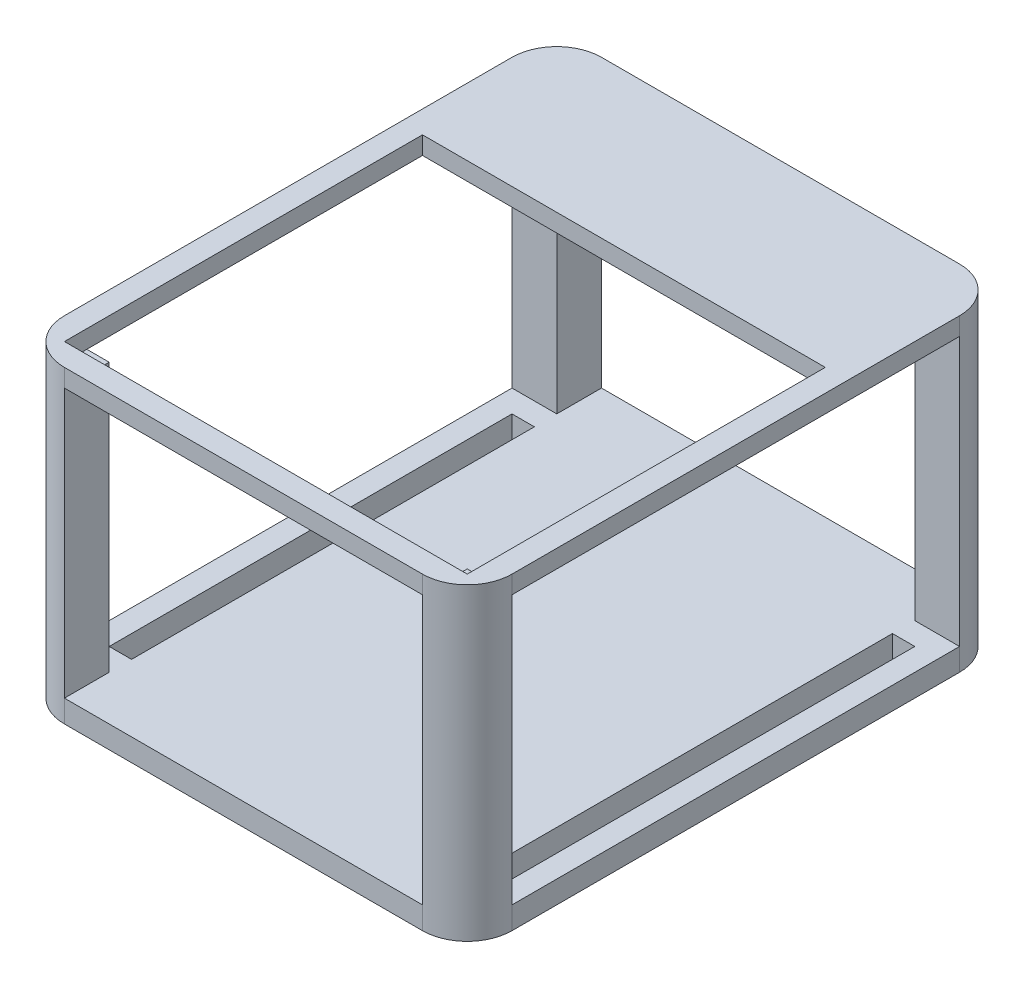
ISO-10303-21;
HEADER;
FILE_DESCRIPTION(('STEP AP214'),'2;1');
FILE_NAME('part.step','',(''),(''),'','','');
FILE_SCHEMA(('AUTOMOTIVE_DESIGN { 1 0 10303 214 1 1 1 1 }'));
ENDSEC;
DATA;
#1=APPLICATION_CONTEXT('core data for automotive mechanical design processes');
#2=APPLICATION_PROTOCOL_DEFINITION('international standard','automotive_design',2000,#1);
#3=PRODUCT_CONTEXT('',#1,'mechanical');
#4=PRODUCT('Part','Part','',(#3));
#5=PRODUCT_RELATED_PRODUCT_CATEGORY('part','',(#4));
#6=PRODUCT_DEFINITION_FORMATION('','',#4);
#7=PRODUCT_DEFINITION_CONTEXT('part definition',#1,'design');
#8=PRODUCT_DEFINITION('design','',#6,#7);
#9=PRODUCT_DEFINITION_SHAPE('','',#8);
#10=(LENGTH_UNIT() NAMED_UNIT(*) SI_UNIT(.MILLI.,.METRE.));
#11=(NAMED_UNIT(*) PLANE_ANGLE_UNIT() SI_UNIT($,.RADIAN.));
#12=(NAMED_UNIT(*) SI_UNIT($,.STERADIAN.) SOLID_ANGLE_UNIT());
#13=UNCERTAINTY_MEASURE_WITH_UNIT(LENGTH_MEASURE(1.E-05),#10,'distance_accuracy_value','');
#14=(GEOMETRIC_REPRESENTATION_CONTEXT(3) GLOBAL_UNCERTAINTY_ASSIGNED_CONTEXT((#13)) GLOBAL_UNIT_ASSIGNED_CONTEXT((#10,
#11,#12)) REPRESENTATION_CONTEXT('',''));
#15=CARTESIAN_POINT('',(0.,0.,0.));
#16=DIRECTION('',(0.,0.,1.));
#17=DIRECTION('',(1.,0.,0.));
#18=AXIS2_PLACEMENT_3D('',#15,#16,#17);
#19=CARTESIAN_POINT('',(40.,65.,-50.));
#20=DIRECTION('',(0.,1.,0.));
#21=DIRECTION('',(0.,0.,1.));
#22=AXIS2_PLACEMENT_3D('',#19,#20,#21);
#23=PLANE('',#22);
#24=DIRECTION('',(-1.,0.,0.));
#25=VECTOR('',#24,1.);
#26=CARTESIAN_POINT('',(-45.,65.,-25.));
#27=LINE('',#26,#25);
#28=CARTESIAN_POINT('',(45.,65.,-25.));
#29=VERTEX_POINT('',#28);
#30=CARTESIAN_POINT('',(-45.,65.,-25.));
#31=VERTEX_POINT('',#30);
#32=EDGE_CURVE('E281',#29,#31,#27,.T.);
#33=ORIENTED_EDGE('',*,*,#32,.T.);
#34=DIRECTION('',(0.,0.,1.));
#35=VECTOR('',#34,1.);
#36=CARTESIAN_POINT('',(-45.,65.,-25.));
#37=LINE('',#36,#35);
#38=CARTESIAN_POINT('',(-45.,65.,50.));
#39=VERTEX_POINT('',#38);
#40=EDGE_CURVE('E273',#31,#39,#37,.T.);
#41=ORIENTED_EDGE('',*,*,#40,.T.);
#42=DIRECTION('',(-1.,0.,0.));
#43=VECTOR('',#42,1.);
#44=CARTESIAN_POINT('',(-50.,65.,50.));
#45=LINE('',#44,#43);
#46=CARTESIAN_POINT('',(-50.,65.,50.));
#47=VERTEX_POINT('',#46);
#48=EDGE_CURVE('E297',#39,#47,#45,.T.);
#49=ORIENTED_EDGE('',*,*,#48,.T.);
#50=DIRECTION('',(0.,0.,1.));
#51=VECTOR('',#50,1.);
#52=CARTESIAN_POINT('',(-50.,65.,-50.));
#53=LINE('',#52,#51);
#54=CARTESIAN_POINT('',(-50.,65.,-50.));
#55=VERTEX_POINT('',#54);
#56=EDGE_CURVE('E580',#55,#47,#53,.T.);
#57=ORIENTED_EDGE('',*,*,#56,.F.);
#58=DIRECTION('',(1.,0.,0.));
#59=VECTOR('',#58,1.);
#60=CARTESIAN_POINT('',(-50.,65.,-50.));
#61=LINE('',#60,#59);
#62=CARTESIAN_POINT('',(-40.,65.,-50.));
#63=VERTEX_POINT('',#62);
#64=EDGE_CURVE('E319',#55,#63,#61,.T.);
#65=ORIENTED_EDGE('',*,*,#64,.T.);
#66=DIRECTION('',(0.,0.,-1.));
#67=VECTOR('',#66,1.);
#68=CARTESIAN_POINT('',(-40.,65.,-50.));
#69=LINE('',#68,#67);
#70=CARTESIAN_POINT('',(-40.,65.,-60.));
#71=VERTEX_POINT('',#70);
#72=EDGE_CURVE('E322',#63,#71,#69,.T.);
#73=ORIENTED_EDGE('',*,*,#72,.T.);
#74=DIRECTION('',(-1.,0.,0.));
#75=VECTOR('',#74,1.);
#76=CARTESIAN_POINT('',(40.,65.,-60.));
#77=LINE('',#76,#75);
#78=CARTESIAN_POINT('',(40.,65.,-60.));
#79=VERTEX_POINT('',#78);
#80=EDGE_CURVE('E582',#79,#71,#77,.T.);
#81=ORIENTED_EDGE('',*,*,#80,.F.);
#82=DIRECTION('',(0.,0.,1.));
#83=VECTOR('',#82,1.);
#84=CARTESIAN_POINT('',(40.,65.,-60.));
#85=LINE('',#84,#83);
#86=CARTESIAN_POINT('',(40.,65.,-50.));
#87=VERTEX_POINT('',#86);
#88=EDGE_CURVE('E528',#79,#87,#85,.T.);
#89=ORIENTED_EDGE('',*,*,#88,.T.);
#90=DIRECTION('',(1.,0.,0.));
#91=VECTOR('',#90,1.);
#92=CARTESIAN_POINT('',(40.,65.,-50.));
#93=LINE('',#92,#91);
#94=CARTESIAN_POINT('',(50.,65.,-50.));
#95=VERTEX_POINT('',#94);
#96=EDGE_CURVE('E524',#87,#95,#93,.T.);
#97=ORIENTED_EDGE('',*,*,#96,.T.);
#98=DIRECTION('',(0.,0.,-1.));
#99=VECTOR('',#98,1.);
#100=CARTESIAN_POINT('',(50.,65.,50.));
#101=LINE('',#100,#99);
#102=CARTESIAN_POINT('',(50.,65.,50.));
#103=VERTEX_POINT('',#102);
#104=EDGE_CURVE('E574',#103,#95,#101,.T.);
#105=ORIENTED_EDGE('',*,*,#104,.F.);
#106=DIRECTION('',(-1.,0.,0.));
#107=VECTOR('',#106,1.);
#108=CARTESIAN_POINT('',(50.,65.,50.));
#109=LINE('',#108,#107);
#110=CARTESIAN_POINT('',(45.,65.,50.));
#111=VERTEX_POINT('',#110);
#112=EDGE_CURVE('E506',#103,#111,#109,.T.);
#113=ORIENTED_EDGE('',*,*,#112,.T.);
#114=DIRECTION('',(0.,0.,-1.));
#115=VECTOR('',#114,1.);
#116=CARTESIAN_POINT('',(45.,65.,-25.));
#117=LINE('',#116,#115);
#118=EDGE_CURVE('E286',#111,#29,#117,.T.);
#119=ORIENTED_EDGE('',*,*,#118,.T.);
#120=EDGE_LOOP('',(#33,#41,#49,#57,#65,#73,#81,#89,#97,#105,#113,#119));
#121=FACE_BOUND('',#120,.T.);
#122=ADVANCED_FACE('F42',(#121),#23,.F.);
#123=CARTESIAN_POINT('',(40.,5.,-50.));
#124=DIRECTION('',(0.,-1.,0.));
#125=DIRECTION('',(0.,0.,-1.));
#126=AXIS2_PLACEMENT_3D('',#123,#124,#125);
#127=CYLINDRICAL_SURFACE('',#126,10.);
#128=CARTESIAN_POINT('',(40.,0.,-50.));
#129=DIRECTION('',(0.,1.,0.));
#130=DIRECTION('',(0.,0.,1.));
#131=AXIS2_PLACEMENT_3D('',#128,#129,#130);
#132=CIRCLE('',#131,10.);
#133=CARTESIAN_POINT('',(50.,0.,-50.));
#134=VERTEX_POINT('',#133);
#135=CARTESIAN_POINT('',(40.,0.,-60.));
#136=VERTEX_POINT('',#135);
#137=EDGE_CURVE('E369',#134,#136,#132,.T.);
#138=ORIENTED_EDGE('',*,*,#137,.T.);
#139=DIRECTION('',(0.,-1.,0.));
#140=VECTOR('',#139,1.);
#141=CARTESIAN_POINT('',(40.,5.,-60.));
#142=LINE('',#141,#140);
#143=CARTESIAN_POINT('',(40.,5.,-60.));
#144=VERTEX_POINT('',#143);
#145=EDGE_CURVE('E11',#144,#136,#142,.T.);
#146=ORIENTED_EDGE('',*,*,#145,.F.);
#147=DIRECTION('',(0.,-1.,0.));
#148=VECTOR('',#147,1.);
#149=CARTESIAN_POINT('',(40.,65.,-60.));
#150=LINE('',#149,#148);
#151=EDGE_CURVE('E515',#79,#144,#150,.T.);
#152=ORIENTED_EDGE('',*,*,#151,.F.);
#153=DIRECTION('',(0.,-1.,0.));
#154=VECTOR('',#153,1.);
#155=CARTESIAN_POINT('',(40.,69.,-60.));
#156=LINE('',#155,#154);
#157=CARTESIAN_POINT('',(40.,69.,-60.));
#158=VERTEX_POINT('',#157);
#159=EDGE_CURVE('E489',#158,#79,#156,.T.);
#160=ORIENTED_EDGE('',*,*,#159,.F.);
#161=CARTESIAN_POINT('',(40.,69.,-50.));
#162=DIRECTION('',(0.,1.,0.));
#163=DIRECTION('',(0.,0.,1.));
#164=AXIS2_PLACEMENT_3D('',#161,#162,#163);
#165=CIRCLE('',#164,10.);
#166=CARTESIAN_POINT('',(50.,69.,-50.));
#167=VERTEX_POINT('',#166);
#168=EDGE_CURVE('E577',#167,#158,#165,.T.);
#169=ORIENTED_EDGE('',*,*,#168,.F.);
#170=DIRECTION('',(0.,-1.,0.));
#171=VECTOR('',#170,1.);
#172=CARTESIAN_POINT('',(50.,69.,-50.));
#173=LINE('',#172,#171);
#174=EDGE_CURVE('E568',#167,#95,#173,.T.);
#175=ORIENTED_EDGE('',*,*,#174,.T.);
#176=DIRECTION('',(0.,-1.,0.));
#177=VECTOR('',#176,1.);
#178=CARTESIAN_POINT('',(50.,65.,-50.));
#179=LINE('',#178,#177);
#180=CARTESIAN_POINT('',(50.,5.,-50.));
#181=VERTEX_POINT('',#180);
#182=EDGE_CURVE('E521',#95,#181,#179,.T.);
#183=ORIENTED_EDGE('',*,*,#182,.T.);
#184=DIRECTION('',(0.,-1.,0.));
#185=VECTOR('',#184,1.);
#186=CARTESIAN_POINT('',(50.,5.,-50.));
#187=LINE('',#186,#185);
#188=EDGE_CURVE('E415',#181,#134,#187,.T.);
#189=ORIENTED_EDGE('',*,*,#188,.T.);
#190=EDGE_LOOP('',(#138,#146,#152,#160,#169,#175,#183,#189));
#191=FACE_BOUND('',#190,.T.);
#192=ADVANCED_FACE('F44',(#191),#127,.T.);
#193=CARTESIAN_POINT('',(-40.,5.,-60.));
#194=DIRECTION('',(0.,0.,1.));
#195=DIRECTION('',(1.,0.,0.));
#196=AXIS2_PLACEMENT_3D('',#193,#194,#195);
#197=PLANE('',#196);
#198=DIRECTION('',(-1.,0.,0.));
#199=VECTOR('',#198,1.);
#200=CARTESIAN_POINT('',(-40.,0.,-60.));
#201=LINE('',#200,#199);
#202=CARTESIAN_POINT('',(-40.,0.,-60.));
#203=VERTEX_POINT('',#202);
#204=EDGE_CURVE('E418',#136,#203,#201,.T.);
#205=ORIENTED_EDGE('',*,*,#204,.T.);
#206=DIRECTION('',(0.,-1.,0.));
#207=VECTOR('',#206,1.);
#208=CARTESIAN_POINT('',(-40.,5.,-60.));
#209=LINE('',#208,#207);
#210=CARTESIAN_POINT('',(-40.,5.,-60.));
#211=VERTEX_POINT('',#210);
#212=EDGE_CURVE('E50',#211,#203,#209,.T.);
#213=ORIENTED_EDGE('',*,*,#212,.F.);
#214=DIRECTION('',(-1.,0.,0.));
#215=VECTOR('',#214,1.);
#216=CARTESIAN_POINT('',(-40.,5.,-60.));
#217=LINE('',#216,#215);
#218=EDGE_CURVE('E406',#144,#211,#217,.T.);
#219=ORIENTED_EDGE('',*,*,#218,.F.);
#220=ORIENTED_EDGE('',*,*,#145,.T.);
#221=EDGE_LOOP('',(#205,#213,#219,#220));
#222=FACE_BOUND('',#221,.T.);
#223=ADVANCED_FACE('F642',(#222),#197,.F.);
#224=CARTESIAN_POINT('',(-40.,5.,-50.));
#225=DIRECTION('',(0.,-1.,0.));
#226=DIRECTION('',(0.,0.,-1.));
#227=AXIS2_PLACEMENT_3D('',#224,#225,#226);
#228=CYLINDRICAL_SURFACE('',#227,10.);
#229=CARTESIAN_POINT('',(-40.,0.,-50.));
#230=DIRECTION('',(0.,1.,0.));
#231=DIRECTION('',(0.,0.,-1.));
#232=AXIS2_PLACEMENT_3D('',#229,#230,#231);
#233=CIRCLE('',#232,10.);
#234=CARTESIAN_POINT('',(-50.,0.,-50.));
#235=VERTEX_POINT('',#234);
#236=EDGE_CURVE('E420',#203,#235,#233,.T.);
#237=ORIENTED_EDGE('',*,*,#236,.T.);
#238=DIRECTION('',(0.,-1.,0.));
#239=VECTOR('',#238,1.);
#240=CARTESIAN_POINT('',(-50.,5.,-50.));
#241=LINE('',#240,#239);
#242=CARTESIAN_POINT('',(-50.,5.,-50.));
#243=VERTEX_POINT('',#242);
#244=EDGE_CURVE('E445',#243,#235,#241,.T.);
#245=ORIENTED_EDGE('',*,*,#244,.F.);
#246=DIRECTION('',(0.,-1.,0.));
#247=VECTOR('',#246,1.);
#248=CARTESIAN_POINT('',(-50.,65.,-50.));
#249=LINE('',#248,#247);
#250=EDGE_CURVE('E338',#55,#243,#249,.T.);
#251=ORIENTED_EDGE('',*,*,#250,.F.);
#252=DIRECTION('',(0.,-1.,0.));
#253=VECTOR('',#252,1.);
#254=CARTESIAN_POINT('',(-50.,69.,-50.));
#255=LINE('',#254,#253);
#256=CARTESIAN_POINT('',(-50.,69.,-50.));
#257=VERTEX_POINT('',#256);
#258=EDGE_CURVE('E477',#257,#55,#255,.T.);
#259=ORIENTED_EDGE('',*,*,#258,.F.);
#260=CARTESIAN_POINT('',(-40.,69.,-50.));
#261=DIRECTION('',(0.,1.,0.));
#262=DIRECTION('',(0.,0.,1.));
#263=AXIS2_PLACEMENT_3D('',#260,#261,#262);
#264=CIRCLE('',#263,10.);
#265=CARTESIAN_POINT('',(-40.,69.,-60.));
#266=VERTEX_POINT('',#265);
#267=EDGE_CURVE('E593',#266,#257,#264,.T.);
#268=ORIENTED_EDGE('',*,*,#267,.F.);
#269=DIRECTION('',(0.,-1.,0.));
#270=VECTOR('',#269,1.);
#271=CARTESIAN_POINT('',(-40.,69.,-60.));
#272=LINE('',#271,#270);
#273=EDGE_CURVE('E481',#266,#71,#272,.T.);
#274=ORIENTED_EDGE('',*,*,#273,.T.);
#275=DIRECTION('',(0.,-1.,0.));
#276=VECTOR('',#275,1.);
#277=CARTESIAN_POINT('',(-40.,65.,-60.));
#278=LINE('',#277,#276);
#279=EDGE_CURVE('E326',#71,#211,#278,.T.);
#280=ORIENTED_EDGE('',*,*,#279,.T.);
#281=ORIENTED_EDGE('',*,*,#212,.T.);
#282=EDGE_LOOP('',(#237,#245,#251,#259,#268,#274,#280,#281));
#283=FACE_BOUND('',#282,.T.);
#284=ADVANCED_FACE('F451',(#283),#228,.T.);
#285=CARTESIAN_POINT('',(-50.,5.,-50.));
#286=DIRECTION('',(1.,0.,0.));
#287=DIRECTION('',(0.,0.,-1.));
#288=AXIS2_PLACEMENT_3D('',#285,#286,#287);
#289=PLANE('',#288);
#290=DIRECTION('',(0.,0.,1.));
#291=VECTOR('',#290,1.);
#292=CARTESIAN_POINT('',(-50.,0.,-50.));
#293=LINE('',#292,#291);
#294=CARTESIAN_POINT('',(-50.,0.,50.));
#295=VERTEX_POINT('',#294);
#296=EDGE_CURVE('E422',#235,#295,#293,.T.);
#297=ORIENTED_EDGE('',*,*,#296,.T.);
#298=DIRECTION('',(0.,-1.,0.));
#299=VECTOR('',#298,1.);
#300=CARTESIAN_POINT('',(-50.,5.,50.));
#301=LINE('',#300,#299);
#302=CARTESIAN_POINT('',(-50.,5.,50.));
#303=VERTEX_POINT('',#302);
#304=EDGE_CURVE('E442',#303,#295,#301,.T.);
#305=ORIENTED_EDGE('',*,*,#304,.F.);
#306=DIRECTION('',(0.,0.,1.));
#307=VECTOR('',#306,1.);
#308=CARTESIAN_POINT('',(-50.,5.,-50.));
#309=LINE('',#308,#307);
#310=EDGE_CURVE('E408',#243,#303,#309,.T.);
#311=ORIENTED_EDGE('',*,*,#310,.F.);
#312=ORIENTED_EDGE('',*,*,#244,.T.);
#313=EDGE_LOOP('',(#297,#305,#311,#312));
#314=FACE_BOUND('',#313,.T.);
#315=ADVANCED_FACE('F464',(#314),#289,.F.);
#316=CARTESIAN_POINT('',(-40.,5.,50.));
#317=DIRECTION('',(0.,-1.,0.));
#318=DIRECTION('',(0.,0.,-1.));
#319=AXIS2_PLACEMENT_3D('',#316,#317,#318);
#320=CYLINDRICAL_SURFACE('',#319,10.);
#321=CARTESIAN_POINT('',(-40.,0.,50.));
#322=DIRECTION('',(0.,1.,0.));
#323=DIRECTION('',(0.,0.,1.));
#324=AXIS2_PLACEMENT_3D('',#321,#322,#323);
#325=CIRCLE('',#324,10.);
#326=CARTESIAN_POINT('',(-40.,0.,60.));
#327=VERTEX_POINT('',#326);
#328=EDGE_CURVE('E424',#295,#327,#325,.T.);
#329=ORIENTED_EDGE('',*,*,#328,.T.);
#330=DIRECTION('',(0.,-1.,0.));
#331=VECTOR('',#330,1.);
#332=CARTESIAN_POINT('',(-40.,5.,60.));
#333=LINE('',#332,#331);
#334=CARTESIAN_POINT('',(-40.,5.,60.));
#335=VERTEX_POINT('',#334);
#336=EDGE_CURVE('E439',#335,#327,#333,.T.);
#337=ORIENTED_EDGE('',*,*,#336,.F.);
#338=DIRECTION('',(0.,-1.,0.));
#339=VECTOR('',#338,1.);
#340=CARTESIAN_POINT('',(-40.,65.,60.));
#341=LINE('',#340,#339);
#342=CARTESIAN_POINT('',(-40.,65.,60.));
#343=VERTEX_POINT('',#342);
#344=EDGE_CURVE('E509',#343,#335,#341,.T.);
#345=ORIENTED_EDGE('',*,*,#344,.F.);
#346=DIRECTION('',(0.,-1.,0.));
#347=VECTOR('',#346,1.);
#348=CARTESIAN_POINT('',(-40.,69.,60.));
#349=LINE('',#348,#347);
#350=CARTESIAN_POINT('',(-40.,69.,60.));
#351=VERTEX_POINT('',#350);
#352=EDGE_CURVE('E478',#351,#343,#349,.T.);
#353=ORIENTED_EDGE('',*,*,#352,.F.);
#354=CARTESIAN_POINT('',(-40.,69.,50.));
#355=DIRECTION('',(0.,1.,0.));
#356=DIRECTION('',(0.,0.,1.));
#357=AXIS2_PLACEMENT_3D('',#354,#355,#356);
#358=CIRCLE('',#357,10.);
#359=CARTESIAN_POINT('',(-50.,69.,50.));
#360=VERTEX_POINT('',#359);
#361=EDGE_CURVE('E474',#360,#351,#358,.T.);
#362=ORIENTED_EDGE('',*,*,#361,.F.);
#363=DIRECTION('',(0.,-1.,0.));
#364=VECTOR('',#363,1.);
#365=CARTESIAN_POINT('',(-50.,69.,50.));
#366=LINE('',#365,#364);
#367=EDGE_CURVE('E472',#360,#47,#366,.T.);
#368=ORIENTED_EDGE('',*,*,#367,.T.);
#369=DIRECTION('',(0.,-1.,0.));
#370=VECTOR('',#369,1.);
#371=CARTESIAN_POINT('',(-50.,65.,50.));
#372=LINE('',#371,#370);
#373=EDGE_CURVE('E305',#47,#303,#372,.T.);
#374=ORIENTED_EDGE('',*,*,#373,.T.);
#375=ORIENTED_EDGE('',*,*,#304,.T.);
#376=EDGE_LOOP('',(#329,#337,#345,#353,#362,#368,#374,#375));
#377=FACE_BOUND('',#376,.T.);
#378=ADVANCED_FACE('F467',(#377),#320,.T.);
#379=CARTESIAN_POINT('',(-40.,5.,60.));
#380=DIRECTION('',(0.,0.,-1.));
#381=DIRECTION('',(-1.,0.,0.));
#382=AXIS2_PLACEMENT_3D('',#379,#380,#381);
#383=PLANE('',#382);
#384=DIRECTION('',(1.,0.,0.));
#385=VECTOR('',#384,1.);
#386=CARTESIAN_POINT('',(-40.,0.,60.));
#387=LINE('',#386,#385);
#388=CARTESIAN_POINT('',(40.,0.,60.));
#389=VERTEX_POINT('',#388);
#390=EDGE_CURVE('E426',#327,#389,#387,.T.);
#391=ORIENTED_EDGE('',*,*,#390,.T.);
#392=DIRECTION('',(0.,-1.,0.));
#393=VECTOR('',#392,1.);
#394=CARTESIAN_POINT('',(40.,5.,60.));
#395=LINE('',#394,#393);
#396=CARTESIAN_POINT('',(40.,5.,60.));
#397=VERTEX_POINT('',#396);
#398=EDGE_CURVE('E436',#397,#389,#395,.T.);
#399=ORIENTED_EDGE('',*,*,#398,.F.);
#400=DIRECTION('',(1.,0.,0.));
#401=VECTOR('',#400,1.);
#402=CARTESIAN_POINT('',(-40.,5.,60.));
#403=LINE('',#402,#401);
#404=EDGE_CURVE('E411',#335,#397,#403,.T.);
#405=ORIENTED_EDGE('',*,*,#404,.F.);
#406=ORIENTED_EDGE('',*,*,#336,.T.);
#407=EDGE_LOOP('',(#391,#399,#405,#406));
#408=FACE_BOUND('',#407,.T.);
#409=ADVANCED_FACE('F548',(#408),#383,.F.);
#410=CARTESIAN_POINT('',(40.,5.,50.));
#411=DIRECTION('',(0.,-1.,0.));
#412=DIRECTION('',(0.,0.,-1.));
#413=AXIS2_PLACEMENT_3D('',#410,#411,#412);
#414=CYLINDRICAL_SURFACE('',#413,10.);
#415=CARTESIAN_POINT('',(40.,0.,50.));
#416=DIRECTION('',(0.,1.,0.));
#417=DIRECTION('',(0.,0.,1.));
#418=AXIS2_PLACEMENT_3D('',#415,#416,#417);
#419=CIRCLE('',#418,10.);
#420=CARTESIAN_POINT('',(50.,0.,50.));
#421=VERTEX_POINT('',#420);
#422=EDGE_CURVE('E428',#389,#421,#419,.T.);
#423=ORIENTED_EDGE('',*,*,#422,.T.);
#424=DIRECTION('',(0.,-1.,0.));
#425=VECTOR('',#424,1.);
#426=CARTESIAN_POINT('',(50.,5.,50.));
#427=LINE('',#426,#425);
#428=CARTESIAN_POINT('',(50.,5.,50.));
#429=VERTEX_POINT('',#428);
#430=EDGE_CURVE('E433',#429,#421,#427,.T.);
#431=ORIENTED_EDGE('',*,*,#430,.F.);
#432=DIRECTION('',(0.,-1.,0.));
#433=VECTOR('',#432,1.);
#434=CARTESIAN_POINT('',(50.,65.,50.));
#435=LINE('',#434,#433);
#436=EDGE_CURVE('E492',#103,#429,#435,.T.);
#437=ORIENTED_EDGE('',*,*,#436,.F.);
#438=DIRECTION('',(0.,-1.,0.));
#439=VECTOR('',#438,1.);
#440=CARTESIAN_POINT('',(50.,69.,50.));
#441=LINE('',#440,#439);
#442=CARTESIAN_POINT('',(50.,69.,50.));
#443=VERTEX_POINT('',#442);
#444=EDGE_CURVE('E566',#443,#103,#441,.T.);
#445=ORIENTED_EDGE('',*,*,#444,.F.);
#446=CARTESIAN_POINT('',(40.,69.,50.));
#447=DIRECTION('',(0.,1.,0.));
#448=DIRECTION('',(0.,0.,1.));
#449=AXIS2_PLACEMENT_3D('',#446,#447,#448);
#450=CIRCLE('',#449,10.);
#451=CARTESIAN_POINT('',(40.,69.,60.));
#452=VERTEX_POINT('',#451);
#453=EDGE_CURVE('E563',#452,#443,#450,.T.);
#454=ORIENTED_EDGE('',*,*,#453,.F.);
#455=DIRECTION('',(0.,-1.,0.));
#456=VECTOR('',#455,1.);
#457=CARTESIAN_POINT('',(40.,69.,60.));
#458=LINE('',#457,#456);
#459=CARTESIAN_POINT('',(40.,65.,60.));
#460=VERTEX_POINT('',#459);
#461=EDGE_CURVE('E484',#452,#460,#458,.T.);
#462=ORIENTED_EDGE('',*,*,#461,.T.);
#463=DIRECTION('',(0.,-1.,0.));
#464=VECTOR('',#463,1.);
#465=CARTESIAN_POINT('',(40.,65.,60.));
#466=LINE('',#465,#464);
#467=EDGE_CURVE('E498',#460,#397,#466,.T.);
#468=ORIENTED_EDGE('',*,*,#467,.T.);
#469=ORIENTED_EDGE('',*,*,#398,.T.);
#470=EDGE_LOOP('',(#423,#431,#437,#445,#454,#462,#468,#469));
#471=FACE_BOUND('',#470,.T.);
#472=ADVANCED_FACE('F559',(#471),#414,.T.);
#473=CARTESIAN_POINT('',(50.,5.,-50.));
#474=DIRECTION('',(-1.,0.,0.));
#475=DIRECTION('',(0.,0.,1.));
#476=AXIS2_PLACEMENT_3D('',#473,#474,#475);
#477=PLANE('',#476);
#478=DIRECTION('',(0.,0.,-1.));
#479=VECTOR('',#478,1.);
#480=CARTESIAN_POINT('',(50.,0.,-50.));
#481=LINE('',#480,#479);
#482=EDGE_CURVE('E409',#421,#134,#481,.T.);
#483=ORIENTED_EDGE('',*,*,#482,.T.);
#484=ORIENTED_EDGE('',*,*,#188,.F.);
#485=DIRECTION('',(0.,0.,-1.));
#486=VECTOR('',#485,1.);
#487=CARTESIAN_POINT('',(50.,5.,-50.));
#488=LINE('',#487,#486);
#489=EDGE_CURVE('E413',#429,#181,#488,.T.);
#490=ORIENTED_EDGE('',*,*,#489,.F.);
#491=ORIENTED_EDGE('',*,*,#430,.T.);
#492=EDGE_LOOP('',(#483,#484,#490,#491));
#493=FACE_BOUND('',#492,.T.);
#494=ADVANCED_FACE('F635',(#493),#477,.F.);
#495=CARTESIAN_POINT('',(40.,5.,-50.));
#496=DIRECTION('',(0.,1.,0.));
#497=DIRECTION('',(0.,0.,1.));
#498=AXIS2_PLACEMENT_3D('',#495,#496,#497);
#499=PLANE('',#498);
#500=DIRECTION('',(1.,0.,0.));
#501=VECTOR('',#500,1.);
#502=CARTESIAN_POINT('',(40.,5.,-50.));
#503=LINE('',#502,#501);
#504=CARTESIAN_POINT('',(40.,5.,-50.));
#505=VERTEX_POINT('',#504);
#506=EDGE_CURVE('E525',#505,#181,#503,.T.);
#507=ORIENTED_EDGE('',*,*,#506,.F.);
#508=DIRECTION('',(0.,0.,1.));
#509=VECTOR('',#508,1.);
#510=CARTESIAN_POINT('',(40.,5.,-60.));
#511=LINE('',#510,#509);
#512=EDGE_CURVE('E330',#144,#505,#511,.T.);
#513=ORIENTED_EDGE('',*,*,#512,.F.);
#514=ORIENTED_EDGE('',*,*,#218,.T.);
#515=DIRECTION('',(0.,0.,-1.));
#516=VECTOR('',#515,1.);
#517=CARTESIAN_POINT('',(-40.,5.,-50.));
#518=LINE('',#517,#516);
#519=CARTESIAN_POINT('',(-40.,5.,-50.));
#520=VERTEX_POINT('',#519);
#521=EDGE_CURVE('E323',#520,#211,#518,.T.);
#522=ORIENTED_EDGE('',*,*,#521,.F.);
#523=DIRECTION('',(1.,0.,0.));
#524=VECTOR('',#523,1.);
#525=CARTESIAN_POINT('',(-50.,5.,-50.));
#526=LINE('',#525,#524);
#527=EDGE_CURVE('E327',#243,#520,#526,.T.);
#528=ORIENTED_EDGE('',*,*,#527,.F.);
#529=ORIENTED_EDGE('',*,*,#310,.T.);
#530=DIRECTION('',(-1.,0.,0.));
#531=VECTOR('',#530,1.);
#532=CARTESIAN_POINT('',(-50.,5.,50.));
#533=LINE('',#532,#531);
#534=CARTESIAN_POINT('',(-40.,5.,50.));
#535=VERTEX_POINT('',#534);
#536=EDGE_CURVE('E318',#535,#303,#533,.T.);
#537=ORIENTED_EDGE('',*,*,#536,.F.);
#538=DIRECTION('',(0.,0.,-1.));
#539=VECTOR('',#538,1.);
#540=CARTESIAN_POINT('',(-40.,5.,50.));
#541=LINE('',#540,#539);
#542=EDGE_CURVE('E313',#335,#535,#541,.T.);
#543=ORIENTED_EDGE('',*,*,#542,.F.);
#544=ORIENTED_EDGE('',*,*,#404,.T.);
#545=DIRECTION('',(0.,0.,1.));
#546=VECTOR('',#545,1.);
#547=CARTESIAN_POINT('',(40.,5.,50.));
#548=LINE('',#547,#546);
#549=CARTESIAN_POINT('',(40.,5.,50.));
#550=VERTEX_POINT('',#549);
#551=EDGE_CURVE('E502',#550,#397,#548,.T.);
#552=ORIENTED_EDGE('',*,*,#551,.F.);
#553=DIRECTION('',(-1.,0.,0.));
#554=VECTOR('',#553,1.);
#555=CARTESIAN_POINT('',(50.,5.,50.));
#556=LINE('',#555,#554);
#557=EDGE_CURVE('E505',#429,#550,#556,.T.);
#558=ORIENTED_EDGE('',*,*,#557,.F.);
#559=ORIENTED_EDGE('',*,*,#489,.T.);
#560=EDGE_LOOP('',(#507,#513,#514,#522,#528,#529,#537,#543,#544,#552,#558,#559));
#561=FACE_BOUND('',#560,.T.);
#562=DIRECTION('',(0.,0.,1.));
#563=VECTOR('',#562,1.);
#564=CARTESIAN_POINT('',(-45.,5.,-45.));
#565=LINE('',#564,#563);
#566=CARTESIAN_POINT('',(-45.,5.,-45.));
#567=VERTEX_POINT('',#566);
#568=CARTESIAN_POINT('',(-45.,5.,45.));
#569=VERTEX_POINT('',#568);
#570=EDGE_CURVE('E356',#567,#569,#565,.T.);
#571=ORIENTED_EDGE('',*,*,#570,.F.);
#572=DIRECTION('',(-1.,0.,0.));
#573=VECTOR('',#572,1.);
#574=CARTESIAN_POINT('',(-45.,5.,-45.));
#575=LINE('',#574,#573);
#576=CARTESIAN_POINT('',(-40.,5.,-45.));
#577=VERTEX_POINT('',#576);
#578=EDGE_CURVE('E346',#577,#567,#575,.T.);
#579=ORIENTED_EDGE('',*,*,#578,.F.);
#580=DIRECTION('',(0.,0.,-1.));
#581=VECTOR('',#580,1.);
#582=CARTESIAN_POINT('',(-40.,5.,-45.));
#583=LINE('',#582,#581);
#584=CARTESIAN_POINT('',(-40.,5.,45.));
#585=VERTEX_POINT('',#584);
#586=EDGE_CURVE('E362',#585,#577,#583,.T.);
#587=ORIENTED_EDGE('',*,*,#586,.F.);
#588=DIRECTION('',(1.,0.,0.));
#589=VECTOR('',#588,1.);
#590=CARTESIAN_POINT('',(-45.,5.,45.));
#591=LINE('',#590,#589);
#592=EDGE_CURVE('E358',#569,#585,#591,.T.);
#593=ORIENTED_EDGE('',*,*,#592,.F.);
#594=EDGE_LOOP('',(#571,#579,#587,#593));
#595=FACE_BOUND('',#594,.T.);
#596=DIRECTION('',(0.,0.,1.));
#597=VECTOR('',#596,1.);
#598=CARTESIAN_POINT('',(40.,5.,-45.));
#599=LINE('',#598,#597);
#600=CARTESIAN_POINT('',(40.,5.,-45.));
#601=VERTEX_POINT('',#600);
#602=CARTESIAN_POINT('',(40.,5.,45.));
#603=VERTEX_POINT('',#602);
#604=EDGE_CURVE('E359',#601,#603,#599,.T.);
#605=ORIENTED_EDGE('',*,*,#604,.F.);
#606=DIRECTION('',(-1.,0.,0.));
#607=VECTOR('',#606,1.);
#608=CARTESIAN_POINT('',(40.,5.,-45.));
#609=LINE('',#608,#607);
#610=CARTESIAN_POINT('',(45.,5.,-45.));
#611=VERTEX_POINT('',#610);
#612=EDGE_CURVE('E385',#611,#601,#609,.T.);
#613=ORIENTED_EDGE('',*,*,#612,.F.);
#614=DIRECTION('',(0.,0.,-1.));
#615=VECTOR('',#614,1.);
#616=CARTESIAN_POINT('',(45.,5.,-45.));
#617=LINE('',#616,#615);
#618=CARTESIAN_POINT('',(45.,5.,45.));
#619=VERTEX_POINT('',#618);
#620=EDGE_CURVE('E388',#619,#611,#617,.T.);
#621=ORIENTED_EDGE('',*,*,#620,.F.);
#622=DIRECTION('',(1.,0.,0.));
#623=VECTOR('',#622,1.);
#624=CARTESIAN_POINT('',(40.,5.,45.));
#625=LINE('',#624,#623);
#626=EDGE_CURVE('E392',#603,#619,#625,.T.);
#627=ORIENTED_EDGE('',*,*,#626,.F.);
#628=EDGE_LOOP('',(#605,#613,#621,#627));
#629=FACE_BOUND('',#628,.T.);
#630=ADVANCED_FACE('F543',(#561,#595,#629),#499,.T.);
#631=CARTESIAN_POINT('',(40.,0.,-50.));
#632=DIRECTION('',(0.,1.,0.));
#633=DIRECTION('',(0.,0.,1.));
#634=AXIS2_PLACEMENT_3D('',#631,#632,#633);
#635=PLANE('',#634);
#636=DIRECTION('',(-1.,0.,0.));
#637=VECTOR('',#636,1.);
#638=CARTESIAN_POINT('',(-45.,0.,-45.));
#639=LINE('',#638,#637);
#640=CARTESIAN_POINT('',(-40.,0.,-45.));
#641=VERTEX_POINT('',#640);
#642=CARTESIAN_POINT('',(-45.,0.,-45.));
#643=VERTEX_POINT('',#642);
#644=EDGE_CURVE('E352',#641,#643,#639,.T.);
#645=ORIENTED_EDGE('',*,*,#644,.T.);
#646=DIRECTION('',(0.,0.,1.));
#647=VECTOR('',#646,1.);
#648=CARTESIAN_POINT('',(-45.,0.,-45.));
#649=LINE('',#648,#647);
#650=CARTESIAN_POINT('',(-45.,0.,45.));
#651=VERTEX_POINT('',#650);
#652=EDGE_CURVE('E342',#643,#651,#649,.T.);
#653=ORIENTED_EDGE('',*,*,#652,.T.);
#654=DIRECTION('',(1.,0.,0.));
#655=VECTOR('',#654,1.);
#656=CARTESIAN_POINT('',(-45.,0.,45.));
#657=LINE('',#656,#655);
#658=CARTESIAN_POINT('',(-40.,0.,45.));
#659=VERTEX_POINT('',#658);
#660=EDGE_CURVE('E345',#651,#659,#657,.T.);
#661=ORIENTED_EDGE('',*,*,#660,.T.);
#662=DIRECTION('',(0.,0.,-1.));
#663=VECTOR('',#662,1.);
#664=CARTESIAN_POINT('',(-40.,0.,-45.));
#665=LINE('',#664,#663);
#666=EDGE_CURVE('E349',#659,#641,#665,.T.);
#667=ORIENTED_EDGE('',*,*,#666,.T.);
#668=EDGE_LOOP('',(#645,#653,#661,#667));
#669=FACE_BOUND('',#668,.T.);
#670=DIRECTION('',(-1.,0.,0.));
#671=VECTOR('',#670,1.);
#672=CARTESIAN_POINT('',(40.,0.,-45.));
#673=LINE('',#672,#671);
#674=CARTESIAN_POINT('',(45.,0.,-45.));
#675=VERTEX_POINT('',#674);
#676=CARTESIAN_POINT('',(40.,0.,-45.));
#677=VERTEX_POINT('',#676);
#678=EDGE_CURVE('E379',#675,#677,#673,.T.);
#679=ORIENTED_EDGE('',*,*,#678,.T.);
#680=DIRECTION('',(0.,0.,1.));
#681=VECTOR('',#680,1.);
#682=CARTESIAN_POINT('',(40.,0.,-45.));
#683=LINE('',#682,#681);
#684=CARTESIAN_POINT('',(40.,0.,45.));
#685=VERTEX_POINT('',#684);
#686=EDGE_CURVE('E389',#677,#685,#683,.T.);
#687=ORIENTED_EDGE('',*,*,#686,.T.);
#688=DIRECTION('',(1.,0.,0.));
#689=VECTOR('',#688,1.);
#690=CARTESIAN_POINT('',(40.,0.,45.));
#691=LINE('',#690,#689);
#692=CARTESIAN_POINT('',(45.,0.,45.));
#693=VERTEX_POINT('',#692);
#694=EDGE_CURVE('E401',#685,#693,#691,.T.);
#695=ORIENTED_EDGE('',*,*,#694,.T.);
#696=DIRECTION('',(0.,0.,-1.));
#697=VECTOR('',#696,1.);
#698=CARTESIAN_POINT('',(45.,0.,-45.));
#699=LINE('',#698,#697);
#700=EDGE_CURVE('E398',#693,#675,#699,.T.);
#701=ORIENTED_EDGE('',*,*,#700,.T.);
#702=EDGE_LOOP('',(#679,#687,#695,#701));
#703=FACE_BOUND('',#702,.T.);
#704=ORIENTED_EDGE('',*,*,#137,.F.);
#705=ORIENTED_EDGE('',*,*,#482,.F.);
#706=ORIENTED_EDGE('',*,*,#422,.F.);
#707=ORIENTED_EDGE('',*,*,#390,.F.);
#708=ORIENTED_EDGE('',*,*,#328,.F.);
#709=ORIENTED_EDGE('',*,*,#296,.F.);
#710=ORIENTED_EDGE('',*,*,#236,.F.);
#711=ORIENTED_EDGE('',*,*,#204,.F.);
#712=EDGE_LOOP('',(#704,#705,#706,#707,#708,#709,#710,#711));
#713=FACE_BOUND('',#712,.T.);
#714=ADVANCED_FACE('F459',(#669,#703,#713),#635,.F.);
#715=CARTESIAN_POINT('',(40.,0.,-45.));
#716=DIRECTION('',(-1.,0.,0.));
#717=DIRECTION('',(0.,0.,1.));
#718=AXIS2_PLACEMENT_3D('',#715,#716,#717);
#719=PLANE('',#718);
#720=ORIENTED_EDGE('',*,*,#604,.T.);
#721=DIRECTION('',(0.,1.,0.));
#722=VECTOR('',#721,1.);
#723=CARTESIAN_POINT('',(40.,0.,45.));
#724=LINE('',#723,#722);
#725=EDGE_CURVE('E376',#685,#603,#724,.T.);
#726=ORIENTED_EDGE('',*,*,#725,.F.);
#727=ORIENTED_EDGE('',*,*,#686,.F.);
#728=DIRECTION('',(0.,1.,0.));
#729=VECTOR('',#728,1.);
#730=CARTESIAN_POINT('',(40.,0.,-45.));
#731=LINE('',#730,#729);
#732=EDGE_CURVE('E341',#677,#601,#731,.T.);
#733=ORIENTED_EDGE('',*,*,#732,.T.);
#734=EDGE_LOOP('',(#720,#726,#727,#733));
#735=FACE_BOUND('',#734,.T.);
#736=ADVANCED_FACE('F848',(#735),#719,.F.);
#737=CARTESIAN_POINT('',(40.,0.,-45.));
#738=DIRECTION('',(0.,0.,-1.));
#739=DIRECTION('',(-1.,0.,0.));
#740=AXIS2_PLACEMENT_3D('',#737,#738,#739);
#741=PLANE('',#740);
#742=ORIENTED_EDGE('',*,*,#612,.T.);
#743=ORIENTED_EDGE('',*,*,#732,.F.);
#744=ORIENTED_EDGE('',*,*,#678,.F.);
#745=DIRECTION('',(0.,1.,0.));
#746=VECTOR('',#745,1.);
#747=CARTESIAN_POINT('',(45.,0.,-45.));
#748=LINE('',#747,#746);
#749=EDGE_CURVE('E382',#675,#611,#748,.T.);
#750=ORIENTED_EDGE('',*,*,#749,.T.);
#751=EDGE_LOOP('',(#742,#743,#744,#750));
#752=FACE_BOUND('',#751,.T.);
#753=ADVANCED_FACE('F838',(#752),#741,.F.);
#754=CARTESIAN_POINT('',(45.,0.,-45.));
#755=DIRECTION('',(1.,0.,0.));
#756=DIRECTION('',(0.,0.,-1.));
#757=AXIS2_PLACEMENT_3D('',#754,#755,#756);
#758=PLANE('',#757);
#759=ORIENTED_EDGE('',*,*,#620,.T.);
#760=ORIENTED_EDGE('',*,*,#749,.F.);
#761=ORIENTED_EDGE('',*,*,#700,.F.);
#762=DIRECTION('',(0.,1.,0.));
#763=VECTOR('',#762,1.);
#764=CARTESIAN_POINT('',(45.,0.,45.));
#765=LINE('',#764,#763);
#766=EDGE_CURVE('E380',#693,#619,#765,.T.);
#767=ORIENTED_EDGE('',*,*,#766,.T.);
#768=EDGE_LOOP('',(#759,#760,#761,#767));
#769=FACE_BOUND('',#768,.T.);
#770=ADVANCED_FACE('F828',(#769),#758,.F.);
#771=CARTESIAN_POINT('',(40.,0.,45.));
#772=DIRECTION('',(0.,0.,1.));
#773=DIRECTION('',(1.,0.,0.));
#774=AXIS2_PLACEMENT_3D('',#771,#772,#773);
#775=PLANE('',#774);
#776=ORIENTED_EDGE('',*,*,#626,.T.);
#777=ORIENTED_EDGE('',*,*,#766,.F.);
#778=ORIENTED_EDGE('',*,*,#694,.F.);
#779=ORIENTED_EDGE('',*,*,#725,.T.);
#780=EDGE_LOOP('',(#776,#777,#778,#779));
#781=FACE_BOUND('',#780,.T.);
#782=ADVANCED_FACE('F818',(#781),#775,.F.);
#783=CARTESIAN_POINT('',(-45.,0.,-45.));
#784=DIRECTION('',(-1.,0.,0.));
#785=DIRECTION('',(0.,0.,1.));
#786=AXIS2_PLACEMENT_3D('',#783,#784,#785);
#787=PLANE('',#786);
#788=ORIENTED_EDGE('',*,*,#570,.T.);
#789=DIRECTION('',(0.,1.,0.));
#790=VECTOR('',#789,1.);
#791=CARTESIAN_POINT('',(-45.,0.,45.));
#792=LINE('',#791,#790);
#793=EDGE_CURVE('E355',#651,#569,#792,.T.);
#794=ORIENTED_EDGE('',*,*,#793,.F.);
#795=ORIENTED_EDGE('',*,*,#652,.F.);
#796=DIRECTION('',(0.,1.,0.));
#797=VECTOR('',#796,1.);
#798=CARTESIAN_POINT('',(-45.,0.,-45.));
#799=LINE('',#798,#797);
#800=EDGE_CURVE('E367',#643,#567,#799,.T.);
#801=ORIENTED_EDGE('',*,*,#800,.T.);
#802=EDGE_LOOP('',(#788,#794,#795,#801));
#803=FACE_BOUND('',#802,.T.);
#804=ADVANCED_FACE('F808',(#803),#787,.F.);
#805=CARTESIAN_POINT('',(-45.,0.,-45.));
#806=DIRECTION('',(0.,0.,-1.));
#807=DIRECTION('',(-1.,0.,0.));
#808=AXIS2_PLACEMENT_3D('',#805,#806,#807);
#809=PLANE('',#808);
#810=ORIENTED_EDGE('',*,*,#578,.T.);
#811=ORIENTED_EDGE('',*,*,#800,.F.);
#812=ORIENTED_EDGE('',*,*,#644,.F.);
#813=DIRECTION('',(0.,1.,0.));
#814=VECTOR('',#813,1.);
#815=CARTESIAN_POINT('',(-40.,0.,-45.));
#816=LINE('',#815,#814);
#817=EDGE_CURVE('E370',#641,#577,#816,.T.);
#818=ORIENTED_EDGE('',*,*,#817,.T.);
#819=EDGE_LOOP('',(#810,#811,#812,#818));
#820=FACE_BOUND('',#819,.T.);
#821=ADVANCED_FACE('F798',(#820),#809,.F.);
#822=CARTESIAN_POINT('',(-40.,0.,-45.));
#823=DIRECTION('',(1.,0.,0.));
#824=DIRECTION('',(0.,0.,-1.));
#825=AXIS2_PLACEMENT_3D('',#822,#823,#824);
#826=PLANE('',#825);
#827=ORIENTED_EDGE('',*,*,#586,.T.);
#828=ORIENTED_EDGE('',*,*,#817,.F.);
#829=ORIENTED_EDGE('',*,*,#666,.F.);
#830=DIRECTION('',(0.,1.,0.));
#831=VECTOR('',#830,1.);
#832=CARTESIAN_POINT('',(-40.,0.,45.));
#833=LINE('',#832,#831);
#834=EDGE_CURVE('E372',#659,#585,#833,.T.);
#835=ORIENTED_EDGE('',*,*,#834,.T.);
#836=EDGE_LOOP('',(#827,#828,#829,#835));
#837=FACE_BOUND('',#836,.T.);
#838=ADVANCED_FACE('F787',(#837),#826,.F.);
#839=CARTESIAN_POINT('',(-45.,0.,45.));
#840=DIRECTION('',(0.,0.,1.));
#841=DIRECTION('',(1.,0.,0.));
#842=AXIS2_PLACEMENT_3D('',#839,#840,#841);
#843=PLANE('',#842);
#844=ORIENTED_EDGE('',*,*,#592,.T.);
#845=ORIENTED_EDGE('',*,*,#834,.F.);
#846=ORIENTED_EDGE('',*,*,#660,.F.);
#847=ORIENTED_EDGE('',*,*,#793,.T.);
#848=EDGE_LOOP('',(#844,#845,#846,#847));
#849=FACE_BOUND('',#848,.T.);
#850=ADVANCED_FACE('F663',(#849),#843,.F.);
#851=CARTESIAN_POINT('',(-50.,65.,-50.));
#852=DIRECTION('',(0.,0.,-1.));
#853=DIRECTION('',(-1.,0.,0.));
#854=AXIS2_PLACEMENT_3D('',#851,#852,#853);
#855=PLANE('',#854);
#856=ORIENTED_EDGE('',*,*,#527,.T.);
#857=DIRECTION('',(0.,-1.,0.));
#858=VECTOR('',#857,1.);
#859=CARTESIAN_POINT('',(-40.,65.,-50.));
#860=LINE('',#859,#858);
#861=EDGE_CURVE('E335',#63,#520,#860,.T.);
#862=ORIENTED_EDGE('',*,*,#861,.F.);
#863=ORIENTED_EDGE('',*,*,#64,.F.);
#864=ORIENTED_EDGE('',*,*,#250,.T.);
#865=EDGE_LOOP('',(#856,#862,#863,#864));
#866=FACE_BOUND('',#865,.T.);
#867=ADVANCED_FACE('F652',(#866),#855,.F.);
#868=CARTESIAN_POINT('',(-40.,65.,-50.));
#869=DIRECTION('',(-1.,0.,0.));
#870=DIRECTION('',(0.,0.,1.));
#871=AXIS2_PLACEMENT_3D('',#868,#869,#870);
#872=PLANE('',#871);
#873=ORIENTED_EDGE('',*,*,#521,.T.);
#874=ORIENTED_EDGE('',*,*,#279,.F.);
#875=ORIENTED_EDGE('',*,*,#72,.F.);
#876=ORIENTED_EDGE('',*,*,#861,.T.);
#877=EDGE_LOOP('',(#873,#874,#875,#876));
#878=FACE_BOUND('',#877,.T.);
#879=ADVANCED_FACE('F654',(#878),#872,.F.);
#880=CARTESIAN_POINT('',(50.,65.,50.));
#881=DIRECTION('',(0.,0.,1.));
#882=DIRECTION('',(1.,0.,0.));
#883=AXIS2_PLACEMENT_3D('',#880,#881,#882);
#884=PLANE('',#883);
#885=ORIENTED_EDGE('',*,*,#557,.T.);
#886=DIRECTION('',(0.,-1.,0.));
#887=VECTOR('',#886,1.);
#888=CARTESIAN_POINT('',(40.,65.,50.));
#889=LINE('',#888,#887);
#890=CARTESIAN_POINT('',(40.,65.,50.));
#891=VERTEX_POINT('',#890);
#892=EDGE_CURVE('E495',#891,#550,#889,.T.);
#893=ORIENTED_EDGE('',*,*,#892,.F.);
#894=EDGE_CURVE('E512',#111,#891,#109,.T.);
#895=ORIENTED_EDGE('',*,*,#894,.F.);
#896=ORIENTED_EDGE('',*,*,#112,.F.);
#897=ORIENTED_EDGE('',*,*,#436,.T.);
#898=EDGE_LOOP('',(#885,#893,#895,#896,#897));
#899=FACE_BOUND('',#898,.T.);
#900=ADVANCED_FACE('F616',(#899),#884,.F.);
#901=CARTESIAN_POINT('',(40.,65.,50.));
#902=DIRECTION('',(1.,0.,0.));
#903=DIRECTION('',(0.,0.,-1.));
#904=AXIS2_PLACEMENT_3D('',#901,#902,#903);
#905=PLANE('',#904);
#906=ORIENTED_EDGE('',*,*,#551,.T.);
#907=ORIENTED_EDGE('',*,*,#467,.F.);
#908=DIRECTION('',(0.,0.,1.));
#909=VECTOR('',#908,1.);
#910=CARTESIAN_POINT('',(40.,65.,50.));
#911=LINE('',#910,#909);
#912=CARTESIAN_POINT('',(40.,65.,55.));
#913=VERTEX_POINT('',#912);
#914=EDGE_CURVE('E501',#913,#460,#911,.T.);
#915=ORIENTED_EDGE('',*,*,#914,.F.);
#916=EDGE_CURVE('E510',#891,#913,#911,.T.);
#917=ORIENTED_EDGE('',*,*,#916,.F.);
#918=ORIENTED_EDGE('',*,*,#892,.T.);
#919=EDGE_LOOP('',(#906,#907,#915,#917,#918));
#920=FACE_BOUND('',#919,.T.);
#921=ADVANCED_FACE('F553',(#920),#905,.F.);
#922=CARTESIAN_POINT('',(-40.,65.,50.));
#923=DIRECTION('',(-1.,0.,0.));
#924=DIRECTION('',(0.,0.,1.));
#925=AXIS2_PLACEMENT_3D('',#922,#923,#924);
#926=PLANE('',#925);
#927=ORIENTED_EDGE('',*,*,#542,.T.);
#928=DIRECTION('',(0.,-1.,0.));
#929=VECTOR('',#928,1.);
#930=CARTESIAN_POINT('',(-40.,65.,50.));
#931=LINE('',#930,#929);
#932=CARTESIAN_POINT('',(-40.,65.,50.));
#933=VERTEX_POINT('',#932);
#934=EDGE_CURVE('E309',#933,#535,#931,.T.);
#935=ORIENTED_EDGE('',*,*,#934,.F.);
#936=DIRECTION('',(0.,0.,-1.));
#937=VECTOR('',#936,1.);
#938=CARTESIAN_POINT('',(-40.,65.,50.));
#939=LINE('',#938,#937);
#940=CARTESIAN_POINT('',(-40.,65.,55.));
#941=VERTEX_POINT('',#940);
#942=EDGE_CURVE('E308',#941,#933,#939,.T.);
#943=ORIENTED_EDGE('',*,*,#942,.F.);
#944=EDGE_CURVE('E315',#343,#941,#939,.T.);
#945=ORIENTED_EDGE('',*,*,#944,.F.);
#946=ORIENTED_EDGE('',*,*,#344,.T.);
#947=EDGE_LOOP('',(#927,#935,#943,#945,#946));
#948=FACE_BOUND('',#947,.T.);
#949=ADVANCED_FACE('F540',(#948),#926,.F.);
#950=CARTESIAN_POINT('',(-50.,65.,50.));
#951=DIRECTION('',(0.,0.,1.));
#952=DIRECTION('',(1.,0.,0.));
#953=AXIS2_PLACEMENT_3D('',#950,#951,#952);
#954=PLANE('',#953);
#955=ORIENTED_EDGE('',*,*,#536,.T.);
#956=ORIENTED_EDGE('',*,*,#373,.F.);
#957=ORIENTED_EDGE('',*,*,#48,.F.);
#958=EDGE_CURVE('E270',#933,#39,#45,.T.);
#959=ORIENTED_EDGE('',*,*,#958,.F.);
#960=ORIENTED_EDGE('',*,*,#934,.T.);
#961=EDGE_LOOP('',(#955,#956,#957,#959,#960));
#962=FACE_BOUND('',#961,.T.);
#963=ADVANCED_FACE('F302',(#962),#954,.F.);
#964=CARTESIAN_POINT('',(40.,65.,-60.));
#965=DIRECTION('',(1.,0.,0.));
#966=DIRECTION('',(0.,0.,-1.));
#967=AXIS2_PLACEMENT_3D('',#964,#965,#966);
#968=PLANE('',#967);
#969=ORIENTED_EDGE('',*,*,#512,.T.);
#970=DIRECTION('',(0.,-1.,0.));
#971=VECTOR('',#970,1.);
#972=CARTESIAN_POINT('',(40.,65.,-50.));
#973=LINE('',#972,#971);
#974=EDGE_CURVE('E518',#87,#505,#973,.T.);
#975=ORIENTED_EDGE('',*,*,#974,.F.);
#976=ORIENTED_EDGE('',*,*,#88,.F.);
#977=ORIENTED_EDGE('',*,*,#151,.T.);
#978=EDGE_LOOP('',(#969,#975,#976,#977));
#979=FACE_BOUND('',#978,.T.);
#980=ADVANCED_FACE('F640',(#979),#968,.F.);
#981=CARTESIAN_POINT('',(40.,65.,-50.));
#982=DIRECTION('',(0.,0.,-1.));
#983=DIRECTION('',(-1.,0.,0.));
#984=AXIS2_PLACEMENT_3D('',#981,#982,#983);
#985=PLANE('',#984);
#986=ORIENTED_EDGE('',*,*,#506,.T.);
#987=ORIENTED_EDGE('',*,*,#182,.F.);
#988=ORIENTED_EDGE('',*,*,#96,.F.);
#989=ORIENTED_EDGE('',*,*,#974,.T.);
#990=EDGE_LOOP('',(#986,#987,#988,#989));
#991=FACE_BOUND('',#990,.T.);
#992=ADVANCED_FACE('F638',(#991),#985,.F.);
#993=ORIENTED_EDGE('',*,*,#944,.T.);
#994=DIRECTION('',(1.,0.,0.));
#995=VECTOR('',#994,1.);
#996=CARTESIAN_POINT('',(-45.,65.,55.));
#997=LINE('',#996,#995);
#998=EDGE_CURVE('E285',#941,#913,#997,.T.);
#999=ORIENTED_EDGE('',*,*,#998,.T.);
#1000=ORIENTED_EDGE('',*,*,#914,.T.);
#1001=DIRECTION('',(1.,0.,0.));
#1002=VECTOR('',#1001,1.);
#1003=CARTESIAN_POINT('',(-40.,65.,60.));
#1004=LINE('',#1003,#1002);
#1005=EDGE_CURVE('E578',#343,#460,#1004,.T.);
#1006=ORIENTED_EDGE('',*,*,#1005,.F.);
#1007=EDGE_LOOP('',(#993,#999,#1000,#1006));
#1008=FACE_BOUND('',#1007,.T.);
#1009=ADVANCED_FACE('F668',(#1008),#23,.F.);
#1010=CARTESIAN_POINT('',(40.,69.,-60.));
#1011=DIRECTION('',(0.,0.,1.));
#1012=DIRECTION('',(1.,0.,0.));
#1013=AXIS2_PLACEMENT_3D('',#1010,#1011,#1012);
#1014=PLANE('',#1013);
#1015=ORIENTED_EDGE('',*,*,#80,.T.);
#1016=ORIENTED_EDGE('',*,*,#273,.F.);
#1017=DIRECTION('',(-1.,0.,0.));
#1018=VECTOR('',#1017,1.);
#1019=CARTESIAN_POINT('',(40.,69.,-60.));
#1020=LINE('',#1019,#1018);
#1021=EDGE_CURVE('E595',#158,#266,#1020,.T.);
#1022=ORIENTED_EDGE('',*,*,#1021,.F.);
#1023=ORIENTED_EDGE('',*,*,#159,.T.);
#1024=EDGE_LOOP('',(#1015,#1016,#1022,#1023));
#1025=FACE_BOUND('',#1024,.T.);
#1026=ADVANCED_FACE('F646',(#1025),#1014,.F.);
#1027=CARTESIAN_POINT('',(-50.,69.,-50.));
#1028=DIRECTION('',(1.,0.,0.));
#1029=DIRECTION('',(0.,0.,-1.));
#1030=AXIS2_PLACEMENT_3D('',#1027,#1028,#1029);
#1031=PLANE('',#1030);
#1032=ORIENTED_EDGE('',*,*,#56,.T.);
#1033=ORIENTED_EDGE('',*,*,#367,.F.);
#1034=DIRECTION('',(0.,0.,1.));
#1035=VECTOR('',#1034,1.);
#1036=CARTESIAN_POINT('',(-50.,69.,-50.));
#1037=LINE('',#1036,#1035);
#1038=EDGE_CURVE('E591',#257,#360,#1037,.T.);
#1039=ORIENTED_EDGE('',*,*,#1038,.F.);
#1040=ORIENTED_EDGE('',*,*,#258,.T.);
#1041=EDGE_LOOP('',(#1032,#1033,#1039,#1040));
#1042=FACE_BOUND('',#1041,.T.);
#1043=ADVANCED_FACE('F650',(#1042),#1031,.F.);
#1044=CARTESIAN_POINT('',(-40.,69.,60.));
#1045=DIRECTION('',(0.,0.,-1.));
#1046=DIRECTION('',(-1.,0.,0.));
#1047=AXIS2_PLACEMENT_3D('',#1044,#1045,#1046);
#1048=PLANE('',#1047);
#1049=ORIENTED_EDGE('',*,*,#1005,.T.);
#1050=ORIENTED_EDGE('',*,*,#461,.F.);
#1051=DIRECTION('',(1.,0.,0.));
#1052=VECTOR('',#1051,1.);
#1053=CARTESIAN_POINT('',(-40.,69.,60.));
#1054=LINE('',#1053,#1052);
#1055=EDGE_CURVE('E588',#351,#452,#1054,.T.);
#1056=ORIENTED_EDGE('',*,*,#1055,.F.);
#1057=ORIENTED_EDGE('',*,*,#352,.T.);
#1058=EDGE_LOOP('',(#1049,#1050,#1056,#1057));
#1059=FACE_BOUND('',#1058,.T.);
#1060=ADVANCED_FACE('F686',(#1059),#1048,.F.);
#1061=CARTESIAN_POINT('',(50.,69.,50.));
#1062=DIRECTION('',(-1.,0.,0.));
#1063=DIRECTION('',(0.,0.,1.));
#1064=AXIS2_PLACEMENT_3D('',#1061,#1062,#1063);
#1065=PLANE('',#1064);
#1066=ORIENTED_EDGE('',*,*,#104,.T.);
#1067=ORIENTED_EDGE('',*,*,#174,.F.);
#1068=DIRECTION('',(0.,0.,-1.));
#1069=VECTOR('',#1068,1.);
#1070=CARTESIAN_POINT('',(50.,69.,50.));
#1071=LINE('',#1070,#1069);
#1072=EDGE_CURVE('E573',#443,#167,#1071,.T.);
#1073=ORIENTED_EDGE('',*,*,#1072,.F.);
#1074=ORIENTED_EDGE('',*,*,#444,.T.);
#1075=EDGE_LOOP('',(#1066,#1067,#1073,#1074));
#1076=FACE_BOUND('',#1075,.T.);
#1077=ADVANCED_FACE('F622',(#1076),#1065,.F.);
#1078=CARTESIAN_POINT('',(40.,69.,-50.));
#1079=DIRECTION('',(0.,1.,0.));
#1080=DIRECTION('',(0.,0.,1.));
#1081=AXIS2_PLACEMENT_3D('',#1078,#1079,#1080);
#1082=PLANE('',#1081);
#1083=DIRECTION('',(0.,0.,1.));
#1084=VECTOR('',#1083,1.);
#1085=CARTESIAN_POINT('',(-45.,69.,-25.));
#1086=LINE('',#1085,#1084);
#1087=CARTESIAN_POINT('',(-45.,69.,-25.));
#1088=VERTEX_POINT('',#1087);
#1089=CARTESIAN_POINT('',(-45.,69.,55.));
#1090=VERTEX_POINT('',#1089);
#1091=EDGE_CURVE('E65',#1088,#1090,#1086,.T.);
#1092=ORIENTED_EDGE('',*,*,#1091,.F.);
#1093=DIRECTION('',(-1.,0.,0.));
#1094=VECTOR('',#1093,1.);
#1095=CARTESIAN_POINT('',(-45.,69.,-25.));
#1096=LINE('',#1095,#1094);
#1097=CARTESIAN_POINT('',(45.,69.,-25.));
#1098=VERTEX_POINT('',#1097);
#1099=EDGE_CURVE('E274',#1098,#1088,#1096,.T.);
#1100=ORIENTED_EDGE('',*,*,#1099,.F.);
#1101=DIRECTION('',(0.,0.,-1.));
#1102=VECTOR('',#1101,1.);
#1103=CARTESIAN_POINT('',(45.,69.,-25.));
#1104=LINE('',#1103,#1102);
#1105=CARTESIAN_POINT('',(45.,69.,55.));
#1106=VERTEX_POINT('',#1105);
#1107=EDGE_CURVE('E605',#1106,#1098,#1104,.T.);
#1108=ORIENTED_EDGE('',*,*,#1107,.F.);
#1109=DIRECTION('',(1.,0.,0.));
#1110=VECTOR('',#1109,1.);
#1111=CARTESIAN_POINT('',(-45.,69.,55.));
#1112=LINE('',#1111,#1110);
#1113=EDGE_CURVE('E608',#1090,#1106,#1112,.T.);
#1114=ORIENTED_EDGE('',*,*,#1113,.F.);
#1115=EDGE_LOOP('',(#1092,#1100,#1108,#1114));
#1116=FACE_BOUND('',#1115,.T.);
#1117=ORIENTED_EDGE('',*,*,#168,.T.);
#1118=ORIENTED_EDGE('',*,*,#1021,.T.);
#1119=ORIENTED_EDGE('',*,*,#267,.T.);
#1120=ORIENTED_EDGE('',*,*,#1038,.T.);
#1121=ORIENTED_EDGE('',*,*,#361,.T.);
#1122=ORIENTED_EDGE('',*,*,#1055,.T.);
#1123=ORIENTED_EDGE('',*,*,#453,.T.);
#1124=ORIENTED_EDGE('',*,*,#1072,.T.);
#1125=EDGE_LOOP('',(#1117,#1118,#1119,#1120,#1121,#1122,#1123,#1124));
#1126=FACE_BOUND('',#1125,.T.);
#1127=ADVANCED_FACE('F629',(#1116,#1126),#1082,.T.);
#1128=CARTESIAN_POINT('',(0.,65.,0.));
#1129=DIRECTION('',(0.,1.,0.));
#1130=DIRECTION('',(0.,0.,1.));
#1131=AXIS2_PLACEMENT_3D('',#1128,#1129,#1130);
#1132=PLANE('',#1131);
#1133=ORIENTED_EDGE('',*,*,#894,.T.);
#1134=ORIENTED_EDGE('',*,*,#916,.T.);
#1135=CARTESIAN_POINT('',(45.,65.,55.));
#1136=VERTEX_POINT('',#1135);
#1137=EDGE_CURVE('E57',#913,#1136,#997,.T.);
#1138=ORIENTED_EDGE('',*,*,#1137,.T.);
#1139=EDGE_CURVE('E289',#1136,#111,#117,.T.);
#1140=ORIENTED_EDGE('',*,*,#1139,.T.);
#1141=EDGE_LOOP('',(#1133,#1134,#1138,#1140));
#1142=FACE_BOUND('',#1141,.T.);
#1143=ADVANCED_FACE('F613',(#1142),#1132,.T.);
#1144=ORIENTED_EDGE('',*,*,#942,.T.);
#1145=ORIENTED_EDGE('',*,*,#958,.T.);
#1146=CARTESIAN_POINT('',(-45.,65.,55.));
#1147=VERTEX_POINT('',#1146);
#1148=EDGE_CURVE('E264',#39,#1147,#37,.T.);
#1149=ORIENTED_EDGE('',*,*,#1148,.T.);
#1150=EDGE_CURVE('E267',#1147,#941,#997,.T.);
#1151=ORIENTED_EDGE('',*,*,#1150,.T.);
#1152=EDGE_LOOP('',(#1144,#1145,#1149,#1151));
#1153=FACE_BOUND('',#1152,.T.);
#1154=ADVANCED_FACE('F265',(#1153),#1132,.T.);
#1155=CARTESIAN_POINT('',(-45.,65.,-25.));
#1156=DIRECTION('',(-1.,0.,0.));
#1157=DIRECTION('',(0.,0.,1.));
#1158=AXIS2_PLACEMENT_3D('',#1155,#1156,#1157);
#1159=PLANE('',#1158);
#1160=ORIENTED_EDGE('',*,*,#1091,.T.);
#1161=DIRECTION('',(0.,1.,0.));
#1162=VECTOR('',#1161,1.);
#1163=CARTESIAN_POINT('',(-45.,65.,55.));
#1164=LINE('',#1163,#1162);
#1165=EDGE_CURVE('E276',#1147,#1090,#1164,.T.);
#1166=ORIENTED_EDGE('',*,*,#1165,.F.);
#1167=ORIENTED_EDGE('',*,*,#1148,.F.);
#1168=ORIENTED_EDGE('',*,*,#40,.F.);
#1169=DIRECTION('',(0.,1.,0.));
#1170=VECTOR('',#1169,1.);
#1171=CARTESIAN_POINT('',(-45.,65.,-25.));
#1172=LINE('',#1171,#1170);
#1173=EDGE_CURVE('E585',#31,#1088,#1172,.T.);
#1174=ORIENTED_EDGE('',*,*,#1173,.T.);
#1175=EDGE_LOOP('',(#1160,#1166,#1167,#1168,#1174));
#1176=FACE_BOUND('',#1175,.T.);
#1177=ADVANCED_FACE('F277',(#1176),#1159,.F.);
#1178=CARTESIAN_POINT('',(-45.,65.,-25.));
#1179=DIRECTION('',(0.,0.,-1.));
#1180=DIRECTION('',(-1.,0.,0.));
#1181=AXIS2_PLACEMENT_3D('',#1178,#1179,#1180);
#1182=PLANE('',#1181);
#1183=ORIENTED_EDGE('',*,*,#1099,.T.);
#1184=ORIENTED_EDGE('',*,*,#1173,.F.);
#1185=ORIENTED_EDGE('',*,*,#32,.F.);
#1186=DIRECTION('',(0.,1.,0.));
#1187=VECTOR('',#1186,1.);
#1188=CARTESIAN_POINT('',(45.,65.,-25.));
#1189=LINE('',#1188,#1187);
#1190=EDGE_CURVE('E600',#29,#1098,#1189,.T.);
#1191=ORIENTED_EDGE('',*,*,#1190,.T.);
#1192=EDGE_LOOP('',(#1183,#1184,#1185,#1191));
#1193=FACE_BOUND('',#1192,.T.);
#1194=ADVANCED_FACE('F997',(#1193),#1182,.F.);
#1195=CARTESIAN_POINT('',(45.,65.,-25.));
#1196=DIRECTION('',(1.,0.,0.));
#1197=DIRECTION('',(0.,0.,-1.));
#1198=AXIS2_PLACEMENT_3D('',#1195,#1196,#1197);
#1199=PLANE('',#1198);
#1200=ORIENTED_EDGE('',*,*,#1107,.T.);
#1201=ORIENTED_EDGE('',*,*,#1190,.F.);
#1202=ORIENTED_EDGE('',*,*,#118,.F.);
#1203=ORIENTED_EDGE('',*,*,#1139,.F.);
#1204=DIRECTION('',(0.,1.,0.));
#1205=VECTOR('',#1204,1.);
#1206=CARTESIAN_POINT('',(45.,65.,55.));
#1207=LINE('',#1206,#1205);
#1208=EDGE_CURVE('E280',#1136,#1106,#1207,.T.);
#1209=ORIENTED_EDGE('',*,*,#1208,.T.);
#1210=EDGE_LOOP('',(#1200,#1201,#1202,#1203,#1209));
#1211=FACE_BOUND('',#1210,.T.);
#1212=ADVANCED_FACE('F1006',(#1211),#1199,.F.);
#1213=CARTESIAN_POINT('',(-45.,65.,55.));
#1214=DIRECTION('',(0.,0.,1.));
#1215=DIRECTION('',(1.,0.,0.));
#1216=AXIS2_PLACEMENT_3D('',#1213,#1214,#1215);
#1217=PLANE('',#1216);
#1218=ORIENTED_EDGE('',*,*,#1113,.T.);
#1219=ORIENTED_EDGE('',*,*,#1208,.F.);
#1220=ORIENTED_EDGE('',*,*,#1137,.F.);
#1221=ORIENTED_EDGE('',*,*,#998,.F.);
#1222=ORIENTED_EDGE('',*,*,#1150,.F.);
#1223=ORIENTED_EDGE('',*,*,#1165,.T.);
#1224=EDGE_LOOP('',(#1218,#1219,#1220,#1221,#1222,#1223));
#1225=FACE_BOUND('',#1224,.T.);
#1226=ADVANCED_FACE('F283',(#1225),#1217,.F.);
#1227=CLOSED_SHELL('',(#122,#192,#223,#284,#315,#378,#409,#472,#494,#630,#714,#736,#753,#770,
#782,#804,#821,#838,#850,#867,#879,#900,#921,#949,#963,#980,#992,#1009,#1026,#1043,#1060,#1077,
#1127,#1143,#1154,#1177,#1194,#1212,#1226));
#1228=MANIFOLD_SOLID_BREP('B2',#1227);
#1229=ADVANCED_BREP_SHAPE_REPRESENTATION('',(#18,#1228),#14);
#1230=SHAPE_DEFINITION_REPRESENTATION(#9,#1229);
ENDSEC;
END-ISO-10303-21;
